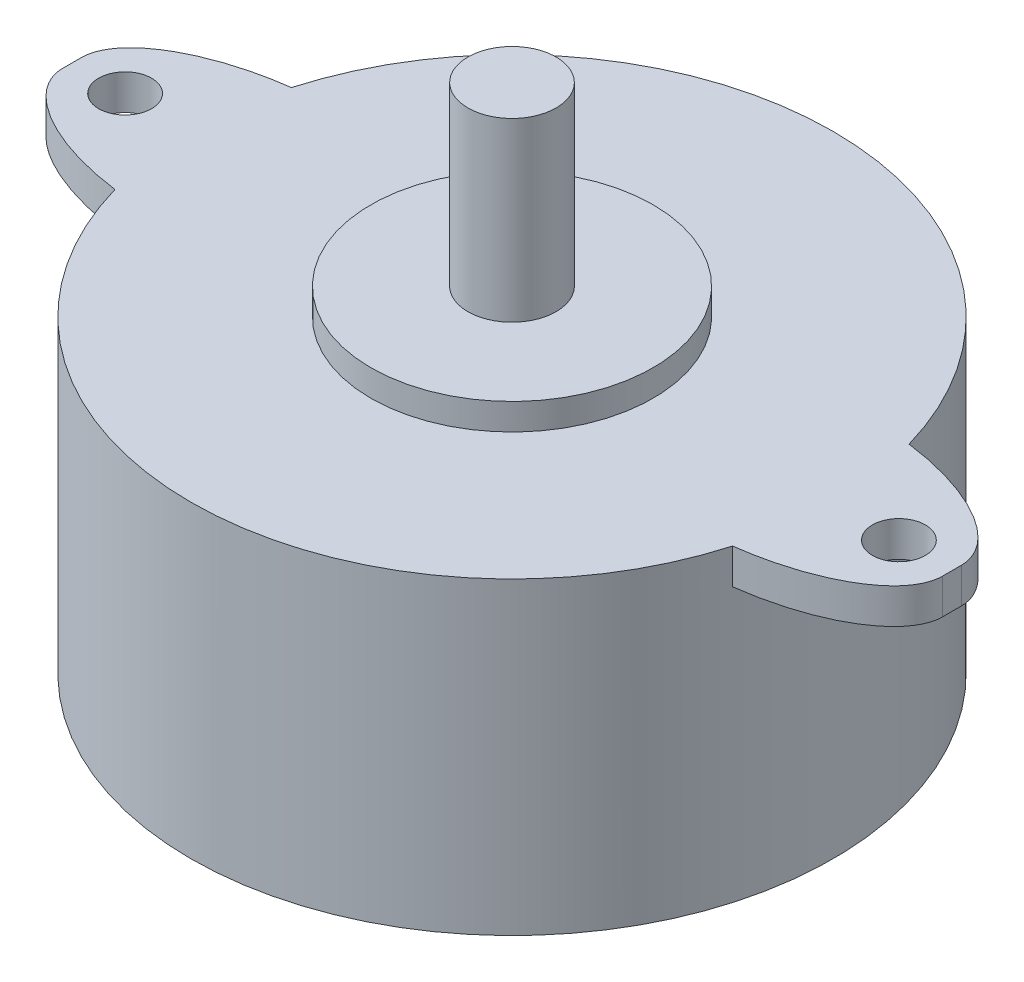
ISO-10303-21;
HEADER;
FILE_DESCRIPTION(('STEP AP214'),'2;1');
FILE_NAME('part.step','',(''),(''),'','','');
FILE_SCHEMA(('AUTOMOTIVE_DESIGN { 1 0 10303 214 1 1 1 1 }'));
ENDSEC;
DATA;
#1=APPLICATION_CONTEXT('core data for automotive mechanical design processes');
#2=APPLICATION_PROTOCOL_DEFINITION('international standard','automotive_design',2000,#1);
#3=PRODUCT_CONTEXT('',#1,'mechanical');
#4=PRODUCT('Part','Part','',(#3));
#5=PRODUCT_RELATED_PRODUCT_CATEGORY('part','',(#4));
#6=PRODUCT_DEFINITION_FORMATION('','',#4);
#7=PRODUCT_DEFINITION_CONTEXT('part definition',#1,'design');
#8=PRODUCT_DEFINITION('design','',#6,#7);
#9=PRODUCT_DEFINITION_SHAPE('','',#8);
#10=(LENGTH_UNIT() NAMED_UNIT(*) SI_UNIT(.MILLI.,.METRE.));
#11=(NAMED_UNIT(*) PLANE_ANGLE_UNIT() SI_UNIT($,.RADIAN.));
#12=(NAMED_UNIT(*) SI_UNIT($,.STERADIAN.) SOLID_ANGLE_UNIT());
#13=UNCERTAINTY_MEASURE_WITH_UNIT(LENGTH_MEASURE(1.E-05),#10,'distance_accuracy_value','');
#14=(GEOMETRIC_REPRESENTATION_CONTEXT(3) GLOBAL_UNCERTAINTY_ASSIGNED_CONTEXT((#13)) GLOBAL_UNIT_ASSIGNED_CONTEXT((#10,
#11,#12)) REPRESENTATION_CONTEXT('',''));
#15=CARTESIAN_POINT('',(0.,0.,0.));
#16=DIRECTION('',(0.,0.,1.));
#17=DIRECTION('',(1.,0.,0.));
#18=AXIS2_PLACEMENT_3D('',#15,#16,#17);
#19=CARTESIAN_POINT('',(0.,17.5,0.));
#20=DIRECTION('',(0.,-1.,0.));
#21=DIRECTION('',(0.,0.,-1.));
#22=AXIS2_PLACEMENT_3D('',#19,#20,#21);
#23=CYLINDRICAL_SURFACE('',#22,18.2);
#24=CARTESIAN_POINT('',(0.,15.5,0.));
#25=DIRECTION('',(0.,-1.,0.));
#26=DIRECTION('',(0.,0.,-1.));
#27=AXIS2_PLACEMENT_3D('',#24,#25,#26);
#28=CIRCLE('',#27,18.2);
#29=CARTESIAN_POINT('',(17.4997142833819,15.5,-5.));
#30=VERTEX_POINT('',#29);
#31=CARTESIAN_POINT('',(17.4997142833819,15.5,5.));
#32=VERTEX_POINT('',#31);
#33=EDGE_CURVE('E150',#30,#32,#28,.T.);
#34=ORIENTED_EDGE('',*,*,#33,.T.);
#35=CARTESIAN_POINT('',(17.4997142833819,17.5,4.99999999999999));
#36=CARTESIAN_POINT('',(17.4997142833819,17.4166666666667,4.99999999999999));
#37=CARTESIAN_POINT('',(17.4997142833819,17.3333333333333,4.99999999999999));
#38=CARTESIAN_POINT('',(17.4997142833819,17.1666666666667,4.99999999999999));
#39=CARTESIAN_POINT('',(17.4997142833819,17.0833333333333,4.99999999999999));
#40=CARTESIAN_POINT('',(17.4997142833819,16.9166666666667,4.99999999999999));
#41=CARTESIAN_POINT('',(17.4997142833819,16.8333333333333,4.99999999999999));
#42=CARTESIAN_POINT('',(17.4997142833819,16.6666666666667,4.99999999999999));
#43=CARTESIAN_POINT('',(17.4997142833819,16.5833333333333,4.99999999999999));
#44=CARTESIAN_POINT('',(17.4997142833819,16.4166666666667,4.99999999999999));
#45=CARTESIAN_POINT('',(17.4997142833819,16.3333333333333,4.99999999999999));
#46=CARTESIAN_POINT('',(17.4997142833819,16.1666666666667,4.99999999999999));
#47=CARTESIAN_POINT('',(17.4997142833819,16.0833333333333,4.99999999999999));
#48=CARTESIAN_POINT('',(17.4997142833819,15.9166666666667,4.99999999999999));
#49=CARTESIAN_POINT('',(17.4997142833819,15.8333333333333,4.99999999999999));
#50=CARTESIAN_POINT('',(17.4997142833819,15.6666666666667,4.99999999999999));
#51=CARTESIAN_POINT('',(17.4997142833819,15.5833333333333,4.99999999999999));
#52=CARTESIAN_POINT('',(17.4997142833819,15.5,4.99999999999999));
#53=B_SPLINE_CURVE_WITH_KNOTS('',3,(#35,#36,#37,#38,#39,#40,#41,#42,#43,#44,#45,#46,#47,#48,#49,
#50,#51,#52),.UNSPECIFIED.,.F.,.F.,(4,2,2,2,2,2,2,2,4),(0.,0.249999999999997,0.499999999999997,
0.749999999999997,1.00000000000001,1.25000000000001,1.5,1.75000000000001,2.),.UNSPECIFIED.);
#54=CARTESIAN_POINT('',(17.4997142833819,17.5,5.));
#55=VERTEX_POINT('',#54);
#56=EDGE_CURVE('E312',#32,#55,#53,.F.);
#57=ORIENTED_EDGE('',*,*,#56,.T.);
#58=CARTESIAN_POINT('',(0.,17.5,0.));
#59=DIRECTION('',(0.,1.,0.));
#60=DIRECTION('',(0.,0.,1.));
#61=AXIS2_PLACEMENT_3D('',#58,#59,#60);
#62=CIRCLE('',#61,18.2);
#63=CARTESIAN_POINT('',(-17.4997142833819,17.5,5.));
#64=VERTEX_POINT('',#63);
#65=EDGE_CURVE('E148',#64,#55,#62,.T.);
#66=ORIENTED_EDGE('',*,*,#65,.F.);
#67=CARTESIAN_POINT('',(-17.4997142833819,15.5,4.99999999999999));
#68=CARTESIAN_POINT('',(-17.4997142833819,15.5833333333333,4.99999999999999));
#69=CARTESIAN_POINT('',(-17.4997142833819,15.6666666666667,4.99999999999999));
#70=CARTESIAN_POINT('',(-17.4997142833819,15.8333333333333,4.99999999999999));
#71=CARTESIAN_POINT('',(-17.4997142833819,15.9166666666667,4.99999999999999));
#72=CARTESIAN_POINT('',(-17.4997142833819,16.0833333333333,4.99999999999999));
#73=CARTESIAN_POINT('',(-17.4997142833819,16.1666666666667,4.99999999999999));
#74=CARTESIAN_POINT('',(-17.4997142833819,16.3333333333333,4.99999999999999));
#75=CARTESIAN_POINT('',(-17.4997142833819,16.4166666666667,4.99999999999999));
#76=CARTESIAN_POINT('',(-17.4997142833819,16.5833333333333,4.99999999999999));
#77=CARTESIAN_POINT('',(-17.4997142833819,16.6666666666667,4.99999999999999));
#78=CARTESIAN_POINT('',(-17.4997142833819,16.8333333333333,4.99999999999999));
#79=CARTESIAN_POINT('',(-17.4997142833819,16.9166666666667,4.99999999999999));
#80=CARTESIAN_POINT('',(-17.4997142833819,17.0833333333333,4.99999999999999));
#81=CARTESIAN_POINT('',(-17.4997142833819,17.1666666666667,4.99999999999999));
#82=CARTESIAN_POINT('',(-17.4997142833819,17.3333333333333,4.99999999999999));
#83=CARTESIAN_POINT('',(-17.4997142833819,17.4166666666667,4.99999999999999));
#84=CARTESIAN_POINT('',(-17.4997142833819,17.5,4.99999999999999));
#85=B_SPLINE_CURVE_WITH_KNOTS('',3,(#67,#68,#69,#70,#71,#72,#73,#74,#75,#76,#77,#78,#79,#80,#81,
#82,#83,#84),.UNSPECIFIED.,.F.,.F.,(4,2,2,2,2,2,2,2,4),(0.,0.249999999999995,0.499999999999995,
0.749999999999992,0.999999999999992,1.25,1.5,1.75,2.),.UNSPECIFIED.);
#86=CARTESIAN_POINT('',(-17.4997142833819,15.5,5.));
#87=VERTEX_POINT('',#86);
#88=EDGE_CURVE('E313',#64,#87,#85,.F.);
#89=ORIENTED_EDGE('',*,*,#88,.T.);
#90=CARTESIAN_POINT('',(-17.4997142833819,15.5,-5.));
#91=VERTEX_POINT('',#90);
#92=EDGE_CURVE('E139',#87,#91,#28,.T.);
#93=ORIENTED_EDGE('',*,*,#92,.T.);
#94=CARTESIAN_POINT('',(-17.4997142833819,17.5,-4.99999999999999));
#95=CARTESIAN_POINT('',(-17.4997142833819,17.4166666666667,-4.99999999999999));
#96=CARTESIAN_POINT('',(-17.4997142833819,17.3333333333333,-4.99999999999999));
#97=CARTESIAN_POINT('',(-17.4997142833819,17.1666666666667,-4.99999999999999));
#98=CARTESIAN_POINT('',(-17.4997142833819,17.0833333333333,-4.99999999999999));
#99=CARTESIAN_POINT('',(-17.4997142833819,16.9166666666667,-4.99999999999999));
#100=CARTESIAN_POINT('',(-17.4997142833819,16.8333333333333,-4.99999999999999));
#101=CARTESIAN_POINT('',(-17.4997142833819,16.6666666666667,-4.99999999999999));
#102=CARTESIAN_POINT('',(-17.4997142833819,16.5833333333333,-4.99999999999999));
#103=CARTESIAN_POINT('',(-17.4997142833819,16.4166666666667,-4.99999999999999));
#104=CARTESIAN_POINT('',(-17.4997142833819,16.3333333333333,-4.99999999999999));
#105=CARTESIAN_POINT('',(-17.4997142833819,16.1666666666667,-4.99999999999999));
#106=CARTESIAN_POINT('',(-17.4997142833819,16.0833333333333,-4.99999999999999));
#107=CARTESIAN_POINT('',(-17.4997142833819,15.9166666666667,-4.99999999999999));
#108=CARTESIAN_POINT('',(-17.4997142833819,15.8333333333333,-4.99999999999999));
#109=CARTESIAN_POINT('',(-17.4997142833819,15.6666666666667,-4.99999999999999));
#110=CARTESIAN_POINT('',(-17.4997142833819,15.5833333333333,-4.99999999999999));
#111=CARTESIAN_POINT('',(-17.4997142833819,15.5,-4.99999999999999));
#112=B_SPLINE_CURVE_WITH_KNOTS('',3,(#94,#95,#96,#97,#98,#99,#100,#101,#102,#103,#104,#105,#106,
#107,#108,#109,#110,#111),.UNSPECIFIED.,.F.,.F.,(4,2,2,2,2,2,2,2,4),(0.,0.249999999999997,
0.499999999999997,0.749999999999997,1.00000000000001,1.25000000000001,1.5,1.75000000000001,2.),.UNSPECIFIED.);
#113=CARTESIAN_POINT('',(-17.4997142833819,17.5,-5.));
#114=VERTEX_POINT('',#113);
#115=EDGE_CURVE('E118',#91,#114,#112,.F.);
#116=ORIENTED_EDGE('',*,*,#115,.T.);
#117=CARTESIAN_POINT('',(17.4997142833819,17.5,-5.));
#118=VERTEX_POINT('',#117);
#119=EDGE_CURVE('E137',#118,#114,#62,.T.);
#120=ORIENTED_EDGE('',*,*,#119,.F.);
#121=CARTESIAN_POINT('',(17.4997142833819,15.5,-4.99999999999999));
#122=CARTESIAN_POINT('',(17.4997142833819,15.5833333333333,-4.99999999999999));
#123=CARTESIAN_POINT('',(17.4997142833819,15.6666666666667,-4.99999999999999));
#124=CARTESIAN_POINT('',(17.4997142833819,15.8333333333333,-4.99999999999999));
#125=CARTESIAN_POINT('',(17.4997142833819,15.9166666666667,-4.99999999999999));
#126=CARTESIAN_POINT('',(17.4997142833819,16.0833333333333,-4.99999999999999));
#127=CARTESIAN_POINT('',(17.4997142833819,16.1666666666667,-4.99999999999999));
#128=CARTESIAN_POINT('',(17.4997142833819,16.3333333333333,-4.99999999999999));
#129=CARTESIAN_POINT('',(17.4997142833819,16.4166666666667,-4.99999999999999));
#130=CARTESIAN_POINT('',(17.4997142833819,16.5833333333333,-4.99999999999999));
#131=CARTESIAN_POINT('',(17.4997142833819,16.6666666666667,-4.99999999999999));
#132=CARTESIAN_POINT('',(17.4997142833819,16.8333333333333,-4.99999999999999));
#133=CARTESIAN_POINT('',(17.4997142833819,16.9166666666667,-4.99999999999999));
#134=CARTESIAN_POINT('',(17.4997142833819,17.0833333333333,-4.99999999999999));
#135=CARTESIAN_POINT('',(17.4997142833819,17.1666666666667,-4.99999999999999));
#136=CARTESIAN_POINT('',(17.4997142833819,17.3333333333333,-4.99999999999999));
#137=CARTESIAN_POINT('',(17.4997142833819,17.4166666666667,-4.99999999999999));
#138=CARTESIAN_POINT('',(17.4997142833819,17.5,-4.99999999999999));
#139=B_SPLINE_CURVE_WITH_KNOTS('',3,(#121,#122,#123,#124,#125,#126,#127,#128,#129,#130,#131,
#132,#133,#134,#135,#136,#137,#138),.UNSPECIFIED.,.F.,.F.,(4,2,2,2,2,2,2,2,4),(0.,
0.249999999999995,0.499999999999995,0.749999999999992,0.999999999999992,1.25,1.5,1.75,2.),.UNSPECIFIED.);
#140=EDGE_CURVE('E140',#118,#30,#139,.F.);
#141=ORIENTED_EDGE('',*,*,#140,.T.);
#142=EDGE_LOOP('',(#34,#57,#66,#89,#93,#116,#120,#141));
#143=FACE_BOUND('',#142,.T.);
#144=CARTESIAN_POINT('',(0.,0.,0.));
#145=DIRECTION('',(0.,1.,0.));
#146=DIRECTION('',(0.,0.,1.));
#147=AXIS2_PLACEMENT_3D('',#144,#145,#146);
#148=CIRCLE('',#147,18.2);
#149=CARTESIAN_POINT('',(0.,0.,18.2));
#150=VERTEX_POINT('',#149);
#151=EDGE_CURVE('E152',#150,#150,#148,.T.);
#152=ORIENTED_EDGE('',*,*,#151,.T.);
#153=EDGE_LOOP('',(#152));
#154=FACE_BOUND('',#153,.T.);
#155=ADVANCED_FACE('F39',(#143,#154),#23,.T.);
#156=CARTESIAN_POINT('',(0.,17.5,0.));
#157=DIRECTION('',(0.,1.,0.));
#158=DIRECTION('',(0.,0.,1.));
#159=AXIS2_PLACEMENT_3D('',#156,#157,#158);
#160=PLANE('',#159);
#161=CARTESIAN_POINT('',(0.,17.5,0.));
#162=DIRECTION('',(0.,1.,0.));
#163=DIRECTION('',(0.,0.,1.));
#164=AXIS2_PLACEMENT_3D('',#161,#162,#163);
#165=CIRCLE('',#164,8.);
#166=CARTESIAN_POINT('',(0.,17.5,8.));
#167=VERTEX_POINT('',#166);
#168=EDGE_CURVE('E467',#167,#167,#165,.T.);
#169=ORIENTED_EDGE('',*,*,#168,.F.);
#170=EDGE_LOOP('',(#169));
#171=FACE_BOUND('',#170,.T.);
#172=DIRECTION('',(0.,0.,1.));
#173=VECTOR('',#172,1.);
#174=CARTESIAN_POINT('',(-24.925,17.5,-5.));
#175=LINE('',#174,#173);
#176=CARTESIAN_POINT('',(-24.925,17.5,-0.536850496288867));
#177=VERTEX_POINT('',#176);
#178=CARTESIAN_POINT('',(-24.925,17.5,0.536850496288867));
#179=VERTEX_POINT('',#178);
#180=EDGE_CURVE('E177',#177,#179,#175,.T.);
#181=ORIENTED_EDGE('',*,*,#180,.T.);
#182=CARTESIAN_POINT('',(-17.4997142833819,17.5,4.99999999999999));
#183=CARTESIAN_POINT('',(-24.925,17.5,4.04385507230183));
#184=CARTESIAN_POINT('',(-24.925,17.5,0.536850496288867));
#185=(BOUNDED_CURVE() B_SPLINE_CURVE(2,(#182,#183,#184),.UNSPECIFIED.,.F.,
.F.) B_SPLINE_CURVE_WITH_KNOTS((3,3),(0.,1.),
.UNSPECIFIED.) CURVE() GEOMETRIC_REPRESENTATION_ITEM() RATIONAL_B_SPLINE_CURVE((1.,
0.750904216660146,1.)) REPRESENTATION_ITEM(''));
#186=EDGE_CURVE('E411',#179,#64,#185,.F.);
#187=ORIENTED_EDGE('',*,*,#186,.T.);
#188=ORIENTED_EDGE('',*,*,#65,.T.);
#189=CARTESIAN_POINT('',(24.925,17.5,0.536850496288867));
#190=CARTESIAN_POINT('',(24.925,17.5,4.04385507230183));
#191=CARTESIAN_POINT('',(17.4997142833819,17.5,4.99999999999999));
#192=(BOUNDED_CURVE() B_SPLINE_CURVE(2,(#189,#190,#191),.UNSPECIFIED.,.F.,
.F.) B_SPLINE_CURVE_WITH_KNOTS((3,3),(0.,1.),
.UNSPECIFIED.) CURVE() GEOMETRIC_REPRESENTATION_ITEM() RATIONAL_B_SPLINE_CURVE((1.,
0.750904216660146,1.)) REPRESENTATION_ITEM(''));
#193=CARTESIAN_POINT('',(24.925,17.5,0.536850496288867));
#194=VERTEX_POINT('',#193);
#195=EDGE_CURVE('E189',#55,#194,#192,.F.);
#196=ORIENTED_EDGE('',*,*,#195,.T.);
#197=DIRECTION('',(0.,0.,-1.));
#198=VECTOR('',#197,1.);
#199=CARTESIAN_POINT('',(24.925,17.5,-5.));
#200=LINE('',#199,#198);
#201=CARTESIAN_POINT('',(24.925,17.5,-0.536850496288867));
#202=VERTEX_POINT('',#201);
#203=EDGE_CURVE('E186',#194,#202,#200,.T.);
#204=ORIENTED_EDGE('',*,*,#203,.T.);
#205=CARTESIAN_POINT('',(17.4997142833819,17.5,-4.99999999999999));
#206=CARTESIAN_POINT('',(24.925,17.5,-4.04385507230183));
#207=CARTESIAN_POINT('',(24.925,17.5,-0.536850496288867));
#208=(BOUNDED_CURVE() B_SPLINE_CURVE(2,(#205,#206,#207),.UNSPECIFIED.,.F.,
.F.) B_SPLINE_CURVE_WITH_KNOTS((3,3),(0.,1.),
.UNSPECIFIED.) CURVE() GEOMETRIC_REPRESENTATION_ITEM() RATIONAL_B_SPLINE_CURVE((1.,
0.750904216660146,1.)) REPRESENTATION_ITEM(''));
#209=EDGE_CURVE('E68',#202,#118,#208,.F.);
#210=ORIENTED_EDGE('',*,*,#209,.T.);
#211=ORIENTED_EDGE('',*,*,#119,.T.);
#212=CARTESIAN_POINT('',(-24.925,17.5,-0.536850496288867));
#213=CARTESIAN_POINT('',(-24.925,17.5,-4.04385507230183));
#214=CARTESIAN_POINT('',(-17.4997142833819,17.5,-4.99999999999999));
#215=(BOUNDED_CURVE() B_SPLINE_CURVE(2,(#212,#213,#214),.UNSPECIFIED.,.F.,
.F.) B_SPLINE_CURVE_WITH_KNOTS((3,3),(0.,1.),
.UNSPECIFIED.) CURVE() GEOMETRIC_REPRESENTATION_ITEM() RATIONAL_B_SPLINE_CURVE((1.,
0.750904216660146,1.)) REPRESENTATION_ITEM(''));
#216=EDGE_CURVE('E113',#114,#177,#215,.F.);
#217=ORIENTED_EDGE('',*,*,#216,.T.);
#218=EDGE_LOOP('',(#181,#187,#188,#196,#204,#210,#211,#217));
#219=FACE_BOUND('',#218,.T.);
#220=CARTESIAN_POINT('',(-21.925,17.5,0.));
#221=DIRECTION('',(0.,1.,0.));
#222=DIRECTION('',(0.,0.,1.));
#223=AXIS2_PLACEMENT_3D('',#220,#221,#222);
#224=CIRCLE('',#223,1.5);
#225=CARTESIAN_POINT('',(-21.925,17.5,1.5));
#226=VERTEX_POINT('',#225);
#227=EDGE_CURVE('E460',#226,#226,#224,.T.);
#228=ORIENTED_EDGE('',*,*,#227,.F.);
#229=EDGE_LOOP('',(#228));
#230=FACE_BOUND('',#229,.T.);
#231=CARTESIAN_POINT('',(21.925,17.5,0.));
#232=DIRECTION('',(0.,1.,0.));
#233=DIRECTION('',(0.,0.,1.));
#234=AXIS2_PLACEMENT_3D('',#231,#232,#233);
#235=CIRCLE('',#234,1.5);
#236=CARTESIAN_POINT('',(21.925,17.5,1.49999999999999));
#237=VERTEX_POINT('',#236);
#238=EDGE_CURVE('E181',#237,#237,#235,.T.);
#239=ORIENTED_EDGE('',*,*,#238,.F.);
#240=EDGE_LOOP('',(#239));
#241=FACE_BOUND('',#240,.T.);
#242=ADVANCED_FACE('F144',(#171,#219,#230,#241),#160,.T.);
#243=CARTESIAN_POINT('',(0.,0.,0.));
#244=DIRECTION('',(0.,1.,0.));
#245=DIRECTION('',(0.,0.,1.));
#246=AXIS2_PLACEMENT_3D('',#243,#244,#245);
#247=PLANE('',#246);
#248=ORIENTED_EDGE('',*,*,#151,.F.);
#249=EDGE_LOOP('',(#248));
#250=FACE_BOUND('',#249,.T.);
#251=ADVANCED_FACE('F479',(#250),#247,.F.);
#252=CARTESIAN_POINT('',(-24.925,15.5,-5.));
#253=DIRECTION('',(-1.,0.,0.));
#254=DIRECTION('',(0.,0.,1.));
#255=AXIS2_PLACEMENT_3D('',#252,#253,#254);
#256=PLANE('',#255);
#257=DIRECTION('',(0.,0.,1.));
#258=VECTOR('',#257,1.);
#259=CARTESIAN_POINT('',(-24.925,15.5,-5.));
#260=LINE('',#259,#258);
#261=CARTESIAN_POINT('',(-24.925,15.5,-0.536850496288867));
#262=VERTEX_POINT('',#261);
#263=CARTESIAN_POINT('',(-24.925,15.5,0.536850496288867));
#264=VERTEX_POINT('',#263);
#265=EDGE_CURVE('E141',#262,#264,#260,.T.);
#266=ORIENTED_EDGE('',*,*,#265,.T.);
#267=CARTESIAN_POINT('',(-24.925,17.6,0.536850496288867));
#268=CARTESIAN_POINT('',(-24.925,16.8666666666667,0.536850496288867));
#269=CARTESIAN_POINT('',(-24.925,16.1333333333333,0.536850496288867));
#270=CARTESIAN_POINT('',(-24.925,15.4,0.536850496288867));
#271=(BOUNDED_CURVE() B_SPLINE_CURVE(3,(#267,#268,#269,#270),.UNSPECIFIED.,.F.,
.F.) B_SPLINE_CURVE_WITH_KNOTS((4,4),(-9.99999999999998E-05,0.0021),
.UNSPECIFIED.) CURVE() GEOMETRIC_REPRESENTATION_ITEM() RATIONAL_B_SPLINE_CURVE((1.,1.,1.,1.)) REPRESENTATION_ITEM(''));
#272=EDGE_CURVE('E406',#264,#179,#271,.F.);
#273=ORIENTED_EDGE('',*,*,#272,.T.);
#274=ORIENTED_EDGE('',*,*,#180,.F.);
#275=CARTESIAN_POINT('',(-24.925,15.4,-0.536850496288867));
#276=CARTESIAN_POINT('',(-24.925,16.1333333333333,-0.536850496288867));
#277=CARTESIAN_POINT('',(-24.925,16.8666666666667,-0.536850496288867));
#278=CARTESIAN_POINT('',(-24.925,17.6,-0.536850496288867));
#279=(BOUNDED_CURVE() B_SPLINE_CURVE(3,(#275,#276,#277,#278),.UNSPECIFIED.,.F.,
.F.) B_SPLINE_CURVE_WITH_KNOTS((4,4),(-0.0001,0.0021),
.UNSPECIFIED.) CURVE() GEOMETRIC_REPRESENTATION_ITEM() RATIONAL_B_SPLINE_CURVE((1.,1.,1.,1.)) REPRESENTATION_ITEM(''));
#280=EDGE_CURVE('E120',#177,#262,#279,.F.);
#281=ORIENTED_EDGE('',*,*,#280,.T.);
#282=EDGE_LOOP('',(#266,#273,#274,#281));
#283=FACE_BOUND('',#282,.T.);
#284=ADVANCED_FACE('F417',(#283),#256,.T.);
#285=CARTESIAN_POINT('',(-21.925,15.5,0.));
#286=DIRECTION('',(0.,1.,0.));
#287=DIRECTION('',(0.,0.,1.));
#288=AXIS2_PLACEMENT_3D('',#285,#286,#287);
#289=CYLINDRICAL_SURFACE('',#288,1.5);
#290=CARTESIAN_POINT('',(-21.925,15.5,0.));
#291=DIRECTION('',(0.,1.,0.));
#292=DIRECTION('',(0.,0.,1.));
#293=AXIS2_PLACEMENT_3D('',#290,#291,#292);
#294=CIRCLE('',#293,1.5);
#295=CARTESIAN_POINT('',(-21.925,15.5,1.5));
#296=VERTEX_POINT('',#295);
#297=EDGE_CURVE('E458',#296,#296,#294,.T.);
#298=ORIENTED_EDGE('',*,*,#297,.F.);
#299=EDGE_LOOP('',(#298));
#300=FACE_BOUND('',#299,.T.);
#301=ORIENTED_EDGE('',*,*,#227,.T.);
#302=EDGE_LOOP('',(#301));
#303=FACE_BOUND('',#302,.T.);
#304=ADVANCED_FACE('F454',(#300,#303),#289,.F.);
#305=CARTESIAN_POINT('',(0.,15.5,0.));
#306=DIRECTION('',(0.,-1.,0.));
#307=DIRECTION('',(0.,0.,-1.));
#308=AXIS2_PLACEMENT_3D('',#305,#306,#307);
#309=PLANE('',#308);
#310=ORIENTED_EDGE('',*,*,#92,.F.);
#311=CARTESIAN_POINT('',(-24.925,15.5,0.536850496288867));
#312=CARTESIAN_POINT('',(-24.925,15.5,4.04385507230183));
#313=CARTESIAN_POINT('',(-17.4997142833819,15.5,4.99999999999999));
#314=(BOUNDED_CURVE() B_SPLINE_CURVE(2,(#311,#312,#313),.UNSPECIFIED.,.F.,
.F.) B_SPLINE_CURVE_WITH_KNOTS((3,3),(0.,1.),
.UNSPECIFIED.) CURVE() GEOMETRIC_REPRESENTATION_ITEM() RATIONAL_B_SPLINE_CURVE((1.,
0.750904216660146,1.)) REPRESENTATION_ITEM(''));
#315=EDGE_CURVE('E404',#87,#264,#314,.F.);
#316=ORIENTED_EDGE('',*,*,#315,.T.);
#317=ORIENTED_EDGE('',*,*,#265,.F.);
#318=CARTESIAN_POINT('',(-17.4997142833819,15.5,-4.99999999999999));
#319=CARTESIAN_POINT('',(-24.925,15.5,-4.04385507230183));
#320=CARTESIAN_POINT('',(-24.925,15.5,-0.536850496288867));
#321=(BOUNDED_CURVE() B_SPLINE_CURVE(2,(#318,#319,#320),.UNSPECIFIED.,.F.,
.F.) B_SPLINE_CURVE_WITH_KNOTS((3,3),(0.,1.),
.UNSPECIFIED.) CURVE() GEOMETRIC_REPRESENTATION_ITEM() RATIONAL_B_SPLINE_CURVE((1.,
0.750904216660146,1.)) REPRESENTATION_ITEM(''));
#322=EDGE_CURVE('E413',#262,#91,#321,.F.);
#323=ORIENTED_EDGE('',*,*,#322,.T.);
#324=EDGE_LOOP('',(#310,#316,#317,#323));
#325=FACE_BOUND('',#324,.T.);
#326=ORIENTED_EDGE('',*,*,#297,.T.);
#327=EDGE_LOOP('',(#326));
#328=FACE_BOUND('',#327,.T.);
#329=ADVANCED_FACE('F419',(#325,#328),#309,.T.);
#330=ORIENTED_EDGE('',*,*,#33,.F.);
#331=CARTESIAN_POINT('',(24.925,15.5,-0.536850496288867));
#332=CARTESIAN_POINT('',(24.925,15.5,-4.04385507230183));
#333=CARTESIAN_POINT('',(17.4997142833819,15.5,-4.99999999999999));
#334=(BOUNDED_CURVE() B_SPLINE_CURVE(2,(#331,#332,#333),.UNSPECIFIED.,.F.,
.F.) B_SPLINE_CURVE_WITH_KNOTS((3,3),(0.,1.),
.UNSPECIFIED.) CURVE() GEOMETRIC_REPRESENTATION_ITEM() RATIONAL_B_SPLINE_CURVE((1.,
0.750904216660146,1.)) REPRESENTATION_ITEM(''));
#335=CARTESIAN_POINT('',(24.925,15.5,-0.536850496288867));
#336=VERTEX_POINT('',#335);
#337=EDGE_CURVE('E12',#30,#336,#334,.F.);
#338=ORIENTED_EDGE('',*,*,#337,.T.);
#339=DIRECTION('',(0.,0.,-1.));
#340=VECTOR('',#339,1.);
#341=CARTESIAN_POINT('',(24.925,15.5,-5.));
#342=LINE('',#341,#340);
#343=CARTESIAN_POINT('',(24.925,15.5,0.536850496288867));
#344=VERTEX_POINT('',#343);
#345=EDGE_CURVE('E174',#344,#336,#342,.T.);
#346=ORIENTED_EDGE('',*,*,#345,.F.);
#347=CARTESIAN_POINT('',(17.4997142833819,15.5,4.99999999999999));
#348=CARTESIAN_POINT('',(24.925,15.5,4.04385507230183));
#349=CARTESIAN_POINT('',(24.925,15.5,0.536850496288867));
#350=(BOUNDED_CURVE() B_SPLINE_CURVE(2,(#347,#348,#349),.UNSPECIFIED.,.F.,
.F.) B_SPLINE_CURVE_WITH_KNOTS((3,3),(0.,1.),
.UNSPECIFIED.) CURVE() GEOMETRIC_REPRESENTATION_ITEM() RATIONAL_B_SPLINE_CURVE((1.,
0.750904216660146,1.)) REPRESENTATION_ITEM(''));
#351=EDGE_CURVE('E127',#344,#32,#350,.F.);
#352=ORIENTED_EDGE('',*,*,#351,.T.);
#353=EDGE_LOOP('',(#330,#338,#346,#352));
#354=FACE_BOUND('',#353,.T.);
#355=CARTESIAN_POINT('',(21.925,15.5,0.));
#356=DIRECTION('',(0.,1.,0.));
#357=DIRECTION('',(0.,0.,1.));
#358=AXIS2_PLACEMENT_3D('',#355,#356,#357);
#359=CIRCLE('',#358,1.5);
#360=CARTESIAN_POINT('',(21.925,15.5,1.49999999999999));
#361=VERTEX_POINT('',#360);
#362=EDGE_CURVE('E187',#361,#361,#359,.T.);
#363=ORIENTED_EDGE('',*,*,#362,.T.);
#364=EDGE_LOOP('',(#363));
#365=FACE_BOUND('',#364,.T.);
#366=ADVANCED_FACE('F453',(#354,#365),#309,.T.);
#367=CARTESIAN_POINT('',(24.925,15.5,-5.));
#368=DIRECTION('',(1.,0.,0.));
#369=DIRECTION('',(0.,0.,-1.));
#370=AXIS2_PLACEMENT_3D('',#367,#368,#369);
#371=PLANE('',#370);
#372=ORIENTED_EDGE('',*,*,#345,.T.);
#373=CARTESIAN_POINT('',(24.925,17.6,-0.536850496288867));
#374=CARTESIAN_POINT('',(24.925,16.8666666666667,-0.536850496288867));
#375=CARTESIAN_POINT('',(24.925,16.1333333333333,-0.536850496288867));
#376=CARTESIAN_POINT('',(24.925,15.4,-0.536850496288867));
#377=(BOUNDED_CURVE() B_SPLINE_CURVE(3,(#373,#374,#375,#376),.UNSPECIFIED.,.F.,
.F.) B_SPLINE_CURVE_WITH_KNOTS((4,4),(-9.99999999999998E-05,0.0021),
.UNSPECIFIED.) CURVE() GEOMETRIC_REPRESENTATION_ITEM() RATIONAL_B_SPLINE_CURVE((1.,1.,1.,1.)) REPRESENTATION_ITEM(''));
#378=EDGE_CURVE('E54',#336,#202,#377,.F.);
#379=ORIENTED_EDGE('',*,*,#378,.T.);
#380=ORIENTED_EDGE('',*,*,#203,.F.);
#381=CARTESIAN_POINT('',(24.925,15.4,0.536850496288867));
#382=CARTESIAN_POINT('',(24.925,16.1333333333333,0.536850496288867));
#383=CARTESIAN_POINT('',(24.925,16.8666666666667,0.536850496288867));
#384=CARTESIAN_POINT('',(24.925,17.6,0.536850496288867));
#385=(BOUNDED_CURVE() B_SPLINE_CURVE(3,(#381,#382,#383,#384),.UNSPECIFIED.,.F.,
.F.) B_SPLINE_CURVE_WITH_KNOTS((4,4),(-0.0001,0.0021),
.UNSPECIFIED.) CURVE() GEOMETRIC_REPRESENTATION_ITEM() RATIONAL_B_SPLINE_CURVE((1.,1.,1.,1.)) REPRESENTATION_ITEM(''));
#386=EDGE_CURVE('E197',#194,#344,#385,.F.);
#387=ORIENTED_EDGE('',*,*,#386,.T.);
#388=EDGE_LOOP('',(#372,#379,#380,#387));
#389=FACE_BOUND('',#388,.T.);
#390=ADVANCED_FACE('F199',(#389),#371,.T.);
#391=CARTESIAN_POINT('',(21.925,15.5,0.));
#392=DIRECTION('',(0.,1.,0.));
#393=DIRECTION('',(0.,0.,1.));
#394=AXIS2_PLACEMENT_3D('',#391,#392,#393);
#395=CYLINDRICAL_SURFACE('',#394,1.5);
#396=ORIENTED_EDGE('',*,*,#362,.F.);
#397=EDGE_LOOP('',(#396));
#398=FACE_BOUND('',#397,.T.);
#399=ORIENTED_EDGE('',*,*,#238,.T.);
#400=EDGE_LOOP('',(#399));
#401=FACE_BOUND('',#400,.T.);
#402=ADVANCED_FACE('F228',(#398,#401),#395,.F.);
#403=CARTESIAN_POINT('',(17.4997142833819,15.4,4.99999999999999));
#404=CARTESIAN_POINT('',(17.4997142833819,16.1333333333333,4.99999999999999));
#405=CARTESIAN_POINT('',(17.4997142833819,16.8666666666667,4.99999999999999));
#406=CARTESIAN_POINT('',(17.4997142833819,17.6,4.99999999999999));
#407=CARTESIAN_POINT('',(24.925,15.4,4.04385507230183));
#408=CARTESIAN_POINT('',(24.925,16.1333333333333,4.04385507230183));
#409=CARTESIAN_POINT('',(24.925,16.8666666666667,4.04385507230183));
#410=CARTESIAN_POINT('',(24.925,17.6,4.04385507230183));
#411=CARTESIAN_POINT('',(24.925,15.4,0.536850496288867));
#412=CARTESIAN_POINT('',(24.925,16.1333333333333,0.536850496288867));
#413=CARTESIAN_POINT('',(24.925,16.8666666666667,0.536850496288867));
#414=CARTESIAN_POINT('',(24.925,17.6,0.536850496288867));
#415=(BOUNDED_SURFACE() B_SPLINE_SURFACE(2,3,((#403,#404,#405,#406),(#407,#408,#409,#410),(#411,
#412,#413,#414)),.UNSPECIFIED.,.F.,.F.,.F.) B_SPLINE_SURFACE_WITH_KNOTS((3,3),(4,4),(0.,1.),
(-0.0001,0.0021),.UNSPECIFIED.) GEOMETRIC_REPRESENTATION_ITEM() RATIONAL_B_SPLINE_SURFACE(((1.,
1.,1.,1.),(0.750904216660146,0.750904216660146,0.750904216660146,0.750904216660146),(1.,1.,1.,1.))) REPRESENTATION_ITEM('') SURFACE());
#416=ORIENTED_EDGE('',*,*,#351,.F.);
#417=ORIENTED_EDGE('',*,*,#386,.F.);
#418=ORIENTED_EDGE('',*,*,#195,.F.);
#419=ORIENTED_EDGE('',*,*,#56,.F.);
#420=EDGE_LOOP('',(#416,#417,#418,#419));
#421=FACE_BOUND('',#420,.T.);
#422=ADVANCED_FACE('F203',(#421),#415,.T.);
#423=CARTESIAN_POINT('',(-17.4997142833819,15.4,-4.99999999999999));
#424=CARTESIAN_POINT('',(-17.4997142833819,16.1333333333333,-4.99999999999999));
#425=CARTESIAN_POINT('',(-17.4997142833819,16.8666666666667,-4.99999999999999));
#426=CARTESIAN_POINT('',(-17.4997142833819,17.6,-4.99999999999999));
#427=CARTESIAN_POINT('',(-24.925,15.4,-4.04385507230183));
#428=CARTESIAN_POINT('',(-24.925,16.1333333333333,-4.04385507230183));
#429=CARTESIAN_POINT('',(-24.925,16.8666666666667,-4.04385507230183));
#430=CARTESIAN_POINT('',(-24.925,17.6,-4.04385507230183));
#431=CARTESIAN_POINT('',(-24.925,15.4,-0.536850496288867));
#432=CARTESIAN_POINT('',(-24.925,16.1333333333333,-0.536850496288867));
#433=CARTESIAN_POINT('',(-24.925,16.8666666666667,-0.536850496288867));
#434=CARTESIAN_POINT('',(-24.925,17.6,-0.536850496288867));
#435=(BOUNDED_SURFACE() B_SPLINE_SURFACE(2,3,((#423,#424,#425,#426),(#427,#428,#429,#430),(#431,
#432,#433,#434)),.UNSPECIFIED.,.F.,.F.,.F.) B_SPLINE_SURFACE_WITH_KNOTS((3,3),(4,4),(0.,1.),
(-0.0001,0.0021),.UNSPECIFIED.) GEOMETRIC_REPRESENTATION_ITEM() RATIONAL_B_SPLINE_SURFACE(((1.,
1.,1.,1.),(0.750904216660146,0.750904216660146,0.750904216660146,0.750904216660146),(1.,1.,1.,1.))) REPRESENTATION_ITEM('') SURFACE());
#436=ORIENTED_EDGE('',*,*,#322,.F.);
#437=ORIENTED_EDGE('',*,*,#280,.F.);
#438=ORIENTED_EDGE('',*,*,#216,.F.);
#439=ORIENTED_EDGE('',*,*,#115,.F.);
#440=EDGE_LOOP('',(#436,#437,#438,#439));
#441=FACE_BOUND('',#440,.T.);
#442=ADVANCED_FACE('F117',(#441),#435,.T.);
#443=CARTESIAN_POINT('',(-24.925,15.4,0.536850496288867));
#444=CARTESIAN_POINT('',(-24.925,16.1333333333333,0.536850496288867));
#445=CARTESIAN_POINT('',(-24.925,16.8666666666667,0.536850496288867));
#446=CARTESIAN_POINT('',(-24.925,17.6,0.536850496288867));
#447=CARTESIAN_POINT('',(-24.925,15.4,4.04385507230183));
#448=CARTESIAN_POINT('',(-24.925,16.1333333333333,4.04385507230183));
#449=CARTESIAN_POINT('',(-24.925,16.8666666666667,4.04385507230183));
#450=CARTESIAN_POINT('',(-24.925,17.6,4.04385507230183));
#451=CARTESIAN_POINT('',(-17.4997142833819,15.4,4.99999999999999));
#452=CARTESIAN_POINT('',(-17.4997142833819,16.1333333333333,4.99999999999999));
#453=CARTESIAN_POINT('',(-17.4997142833819,16.8666666666667,4.99999999999999));
#454=CARTESIAN_POINT('',(-17.4997142833819,17.6,4.99999999999999));
#455=(BOUNDED_SURFACE() B_SPLINE_SURFACE(2,3,((#443,#444,#445,#446),(#447,#448,#449,#450),(#451,
#452,#453,#454)),.UNSPECIFIED.,.F.,.F.,.F.) B_SPLINE_SURFACE_WITH_KNOTS((3,3),(4,4),(0.,1.),
(-0.0001,0.0021),.UNSPECIFIED.) GEOMETRIC_REPRESENTATION_ITEM() RATIONAL_B_SPLINE_SURFACE(((1.,
1.,1.,1.),(0.750904216660146,0.750904216660146,0.750904216660146,0.750904216660146),(1.,1.,1.,1.))) REPRESENTATION_ITEM('') SURFACE());
#456=ORIENTED_EDGE('',*,*,#315,.F.);
#457=ORIENTED_EDGE('',*,*,#88,.F.);
#458=ORIENTED_EDGE('',*,*,#186,.F.);
#459=ORIENTED_EDGE('',*,*,#272,.F.);
#460=EDGE_LOOP('',(#456,#457,#458,#459));
#461=FACE_BOUND('',#460,.T.);
#462=ADVANCED_FACE('F366',(#461),#455,.T.);
#463=CARTESIAN_POINT('',(24.925,15.4,-0.536850496288867));
#464=CARTESIAN_POINT('',(24.925,16.1333333333333,-0.536850496288867));
#465=CARTESIAN_POINT('',(24.925,16.8666666666667,-0.536850496288867));
#466=CARTESIAN_POINT('',(24.925,17.6,-0.536850496288867));
#467=CARTESIAN_POINT('',(24.925,15.4,-4.04385507230183));
#468=CARTESIAN_POINT('',(24.925,16.1333333333333,-4.04385507230183));
#469=CARTESIAN_POINT('',(24.925,16.8666666666667,-4.04385507230183));
#470=CARTESIAN_POINT('',(24.925,17.6,-4.04385507230183));
#471=CARTESIAN_POINT('',(17.4997142833819,15.4,-4.99999999999999));
#472=CARTESIAN_POINT('',(17.4997142833819,16.1333333333333,-4.99999999999999));
#473=CARTESIAN_POINT('',(17.4997142833819,16.8666666666667,-4.99999999999999));
#474=CARTESIAN_POINT('',(17.4997142833819,17.6,-4.99999999999999));
#475=(BOUNDED_SURFACE() B_SPLINE_SURFACE(2,3,((#463,#464,#465,#466),(#467,#468,#469,#470),(#471,
#472,#473,#474)),.UNSPECIFIED.,.F.,.F.,.F.) B_SPLINE_SURFACE_WITH_KNOTS((3,3),(4,4),(0.,1.),
(-0.0001,0.0021),.UNSPECIFIED.) GEOMETRIC_REPRESENTATION_ITEM() RATIONAL_B_SPLINE_SURFACE(((1.,
1.,1.,1.),(0.750904216660146,0.750904216660146,0.750904216660146,0.750904216660146),(1.,1.,1.,1.))) REPRESENTATION_ITEM('') SURFACE());
#476=ORIENTED_EDGE('',*,*,#337,.F.);
#477=ORIENTED_EDGE('',*,*,#140,.F.);
#478=ORIENTED_EDGE('',*,*,#209,.F.);
#479=ORIENTED_EDGE('',*,*,#378,.F.);
#480=EDGE_LOOP('',(#476,#477,#478,#479));
#481=FACE_BOUND('',#480,.T.);
#482=ADVANCED_FACE('F42',(#481),#475,.T.);
#483=CARTESIAN_POINT('',(0.,19.,0.));
#484=DIRECTION('',(0.,-1.,0.));
#485=DIRECTION('',(0.,0.,-1.));
#486=AXIS2_PLACEMENT_3D('',#483,#484,#485);
#487=CYLINDRICAL_SURFACE('',#486,8.);
#488=CARTESIAN_POINT('',(0.,19.,0.));
#489=DIRECTION('',(0.,1.,0.));
#490=DIRECTION('',(0.,0.,1.));
#491=AXIS2_PLACEMENT_3D('',#488,#489,#490);
#492=CIRCLE('',#491,8.);
#493=CARTESIAN_POINT('',(0.,19.,8.));
#494=VERTEX_POINT('',#493);
#495=EDGE_CURVE('E464',#494,#494,#492,.T.);
#496=ORIENTED_EDGE('',*,*,#495,.F.);
#497=EDGE_LOOP('',(#496));
#498=FACE_BOUND('',#497,.T.);
#499=ORIENTED_EDGE('',*,*,#168,.T.);
#500=EDGE_LOOP('',(#499));
#501=FACE_BOUND('',#500,.T.);
#502=ADVANCED_FACE('F604',(#498,#501),#487,.T.);
#503=CARTESIAN_POINT('',(0.,19.,0.));
#504=DIRECTION('',(0.,1.,0.));
#505=DIRECTION('',(0.,0.,1.));
#506=AXIS2_PLACEMENT_3D('',#503,#504,#505);
#507=PLANE('',#506);
#508=CARTESIAN_POINT('',(0.,19.,0.));
#509=DIRECTION('',(0.,1.,0.));
#510=DIRECTION('',(0.,0.,1.));
#511=AXIS2_PLACEMENT_3D('',#508,#509,#510);
#512=CIRCLE('',#511,2.5);
#513=CARTESIAN_POINT('',(0.,19.,2.5));
#514=VERTEX_POINT('',#513);
#515=EDGE_CURVE('E703',#514,#514,#512,.T.);
#516=ORIENTED_EDGE('',*,*,#515,.F.);
#517=EDGE_LOOP('',(#516));
#518=FACE_BOUND('',#517,.T.);
#519=ORIENTED_EDGE('',*,*,#495,.T.);
#520=EDGE_LOOP('',(#519));
#521=FACE_BOUND('',#520,.T.);
#522=ADVANCED_FACE('F610',(#518,#521),#507,.T.);
#523=CARTESIAN_POINT('',(0.,29.,0.));
#524=DIRECTION('',(0.,-1.,0.));
#525=DIRECTION('',(0.,0.,-1.));
#526=AXIS2_PLACEMENT_3D('',#523,#524,#525);
#527=CYLINDRICAL_SURFACE('',#526,2.5);
#528=CARTESIAN_POINT('',(0.,29.,0.));
#529=DIRECTION('',(0.,1.,0.));
#530=DIRECTION('',(0.,0.,1.));
#531=AXIS2_PLACEMENT_3D('',#528,#529,#530);
#532=CIRCLE('',#531,2.5);
#533=CARTESIAN_POINT('',(0.,29.,2.5));
#534=VERTEX_POINT('',#533);
#535=EDGE_CURVE('E702',#534,#534,#532,.T.);
#536=ORIENTED_EDGE('',*,*,#535,.F.);
#537=EDGE_LOOP('',(#536));
#538=FACE_BOUND('',#537,.T.);
#539=ORIENTED_EDGE('',*,*,#515,.T.);
#540=EDGE_LOOP('',(#539));
#541=FACE_BOUND('',#540,.T.);
#542=ADVANCED_FACE('F618',(#538,#541),#527,.T.);
#543=CARTESIAN_POINT('',(0.,29.,0.));
#544=DIRECTION('',(0.,1.,0.));
#545=DIRECTION('',(0.,0.,1.));
#546=AXIS2_PLACEMENT_3D('',#543,#544,#545);
#547=PLANE('',#546);
#548=ORIENTED_EDGE('',*,*,#535,.T.);
#549=EDGE_LOOP('',(#548));
#550=FACE_BOUND('',#549,.T.);
#551=ADVANCED_FACE('F626',(#550),#547,.T.);
#552=CLOSED_SHELL('',(#155,#242,#251,#284,#304,#329,#366,#390,#402,#422,#442,#462,#482,#502,
#522,#542,#551));
#553=MANIFOLD_SOLID_BREP('B2',#552);
#554=ADVANCED_BREP_SHAPE_REPRESENTATION('',(#18,#553),#14);
#555=SHAPE_DEFINITION_REPRESENTATION(#9,#554);
ENDSEC;
END-ISO-10303-21;
